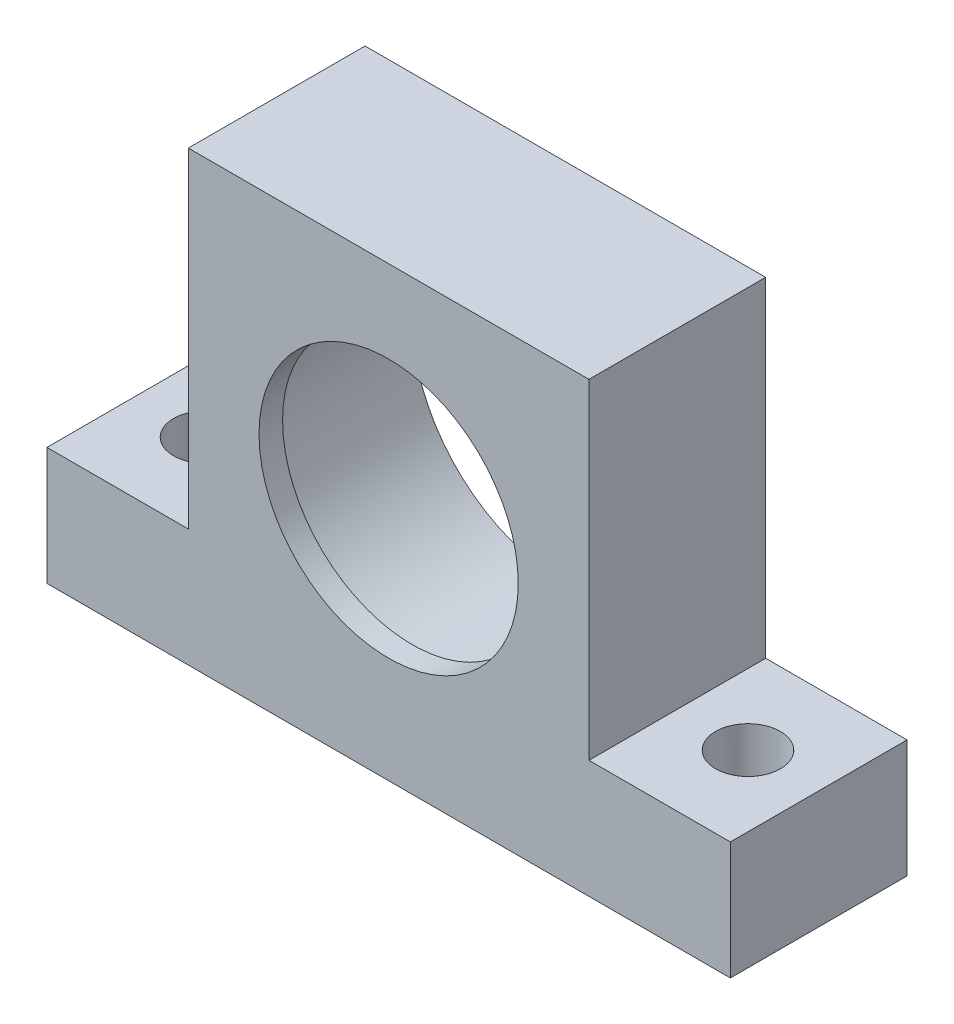
ISO-10303-21;
HEADER;
FILE_DESCRIPTION(('STEP AP214'),'2;1');
FILE_NAME('part.step','',(''),(''),'','','');
FILE_SCHEMA(('AUTOMOTIVE_DESIGN { 1 0 10303 214 1 1 1 1 }'));
ENDSEC;
DATA;
#1=APPLICATION_CONTEXT('core data for automotive mechanical design processes');
#2=APPLICATION_PROTOCOL_DEFINITION('international standard','automotive_design',2000,#1);
#3=PRODUCT_CONTEXT('',#1,'mechanical');
#4=PRODUCT('Part','Part','',(#3));
#5=PRODUCT_RELATED_PRODUCT_CATEGORY('part','',(#4));
#6=PRODUCT_DEFINITION_FORMATION('','',#4);
#7=PRODUCT_DEFINITION_CONTEXT('part definition',#1,'design');
#8=PRODUCT_DEFINITION('design','',#6,#7);
#9=PRODUCT_DEFINITION_SHAPE('','',#8);
#10=(LENGTH_UNIT() NAMED_UNIT(*) SI_UNIT(.MILLI.,.METRE.));
#11=(NAMED_UNIT(*) PLANE_ANGLE_UNIT() SI_UNIT($,.RADIAN.));
#12=(NAMED_UNIT(*) SI_UNIT($,.STERADIAN.) SOLID_ANGLE_UNIT());
#13=UNCERTAINTY_MEASURE_WITH_UNIT(LENGTH_MEASURE(1.E-05),#10,'distance_accuracy_value','');
#14=(GEOMETRIC_REPRESENTATION_CONTEXT(3) GLOBAL_UNCERTAINTY_ASSIGNED_CONTEXT((#13)) GLOBAL_UNIT_ASSIGNED_CONTEXT((#10,
#11,#12)) REPRESENTATION_CONTEXT('',''));
#15=CARTESIAN_POINT('',(0.,0.,0.));
#16=DIRECTION('',(0.,0.,1.));
#17=DIRECTION('',(1.,0.,0.));
#18=AXIS2_PLACEMENT_3D('',#15,#16,#17);
#19=CARTESIAN_POINT('',(0.,20.,15.));
#20=DIRECTION('',(0.,0.,-1.));
#21=DIRECTION('',(-1.,0.,0.));
#22=AXIS2_PLACEMENT_3D('',#19,#20,#21);
#23=CYLINDRICAL_SURFACE('',#22,11.);
#24=CARTESIAN_POINT('',(0.,20.,15.));
#25=DIRECTION('',(0.,0.,-1.));
#26=DIRECTION('',(-1.,0.,0.));
#27=AXIS2_PLACEMENT_3D('',#24,#25,#26);
#28=CIRCLE('',#27,11.);
#29=CARTESIAN_POINT('',(-11.,20.,15.));
#30=VERTEX_POINT('',#29);
#31=EDGE_CURVE('E145',#30,#30,#28,.T.);
#32=ORIENTED_EDGE('',*,*,#31,.F.);
#33=EDGE_LOOP('',(#32));
#34=FACE_BOUND('',#33,.T.);
#35=CARTESIAN_POINT('',(0.,20.,13.));
#36=DIRECTION('',(0.,0.,-1.));
#37=DIRECTION('',(-1.,0.,0.));
#38=AXIS2_PLACEMENT_3D('',#35,#36,#37);
#39=CIRCLE('',#38,11.);
#40=CARTESIAN_POINT('',(-11.,20.,13.));
#41=VERTEX_POINT('',#40);
#42=EDGE_CURVE('E170',#41,#41,#39,.F.);
#43=ORIENTED_EDGE('',*,*,#42,.F.);
#44=EDGE_LOOP('',(#43));
#45=FACE_BOUND('',#44,.T.);
#46=ADVANCED_FACE('F41',(#34,#45),#23,.F.);
#47=CARTESIAN_POINT('',(-29.,0.,15.));
#48=DIRECTION('',(1.,0.,0.));
#49=DIRECTION('',(0.,0.,-1.));
#50=AXIS2_PLACEMENT_3D('',#47,#48,#49);
#51=PLANE('',#50);
#52=DIRECTION('',(0.,-1.,0.));
#53=VECTOR('',#52,1.);
#54=CARTESIAN_POINT('',(-29.,0.,0.));
#55=LINE('',#54,#53);
#56=CARTESIAN_POINT('',(-29.,9.99999999999999,0.));
#57=VERTEX_POINT('',#56);
#58=CARTESIAN_POINT('',(-29.,0.,0.));
#59=VERTEX_POINT('',#58);
#60=EDGE_CURVE('E139',#57,#59,#55,.T.);
#61=ORIENTED_EDGE('',*,*,#60,.T.);
#62=DIRECTION('',(0.,0.,-1.));
#63=VECTOR('',#62,1.);
#64=CARTESIAN_POINT('',(-29.,0.,15.));
#65=LINE('',#64,#63);
#66=CARTESIAN_POINT('',(-29.,0.,15.));
#67=VERTEX_POINT('',#66);
#68=EDGE_CURVE('E12',#67,#59,#65,.T.);
#69=ORIENTED_EDGE('',*,*,#68,.F.);
#70=DIRECTION('',(0.,-1.,0.));
#71=VECTOR('',#70,1.);
#72=CARTESIAN_POINT('',(-29.,0.,15.));
#73=LINE('',#72,#71);
#74=CARTESIAN_POINT('',(-29.,9.99999999999999,15.));
#75=VERTEX_POINT('',#74);
#76=EDGE_CURVE('E154',#75,#67,#73,.T.);
#77=ORIENTED_EDGE('',*,*,#76,.F.);
#78=DIRECTION('',(0.,0.,-1.));
#79=VECTOR('',#78,1.);
#80=CARTESIAN_POINT('',(-29.,9.99999999999999,15.));
#81=LINE('',#80,#79);
#82=EDGE_CURVE('E138',#75,#57,#81,.T.);
#83=ORIENTED_EDGE('',*,*,#82,.T.);
#84=EDGE_LOOP('',(#61,#69,#77,#83));
#85=FACE_BOUND('',#84,.T.);
#86=ADVANCED_FACE('F43',(#85),#51,.F.);
#87=CARTESIAN_POINT('',(29.,0.,15.));
#88=DIRECTION('',(0.,1.,0.));
#89=DIRECTION('',(0.,0.,1.));
#90=AXIS2_PLACEMENT_3D('',#87,#88,#89);
#91=PLANE('',#90);
#92=CARTESIAN_POINT('',(-23.,0.,7.5));
#93=DIRECTION('',(0.,-1.,0.));
#94=DIRECTION('',(0.,0.,-1.));
#95=AXIS2_PLACEMENT_3D('',#92,#93,#94);
#96=CIRCLE('',#95,2.75);
#97=CARTESIAN_POINT('',(-23.,0.,4.75));
#98=VERTEX_POINT('',#97);
#99=EDGE_CURVE('E175',#98,#98,#96,.T.);
#100=ORIENTED_EDGE('',*,*,#99,.F.);
#101=EDGE_LOOP('',(#100));
#102=FACE_BOUND('',#101,.T.);
#103=CARTESIAN_POINT('',(23.,0.,7.5));
#104=DIRECTION('',(0.,-1.,0.));
#105=DIRECTION('',(0.,0.,1.));
#106=AXIS2_PLACEMENT_3D('',#103,#104,#105);
#107=CIRCLE('',#106,2.75);
#108=CARTESIAN_POINT('',(23.,0.,10.25));
#109=VERTEX_POINT('',#108);
#110=EDGE_CURVE('E176',#109,#109,#107,.T.);
#111=ORIENTED_EDGE('',*,*,#110,.F.);
#112=EDGE_LOOP('',(#111));
#113=FACE_BOUND('',#112,.T.);
#114=DIRECTION('',(1.,0.,0.));
#115=VECTOR('',#114,1.);
#116=CARTESIAN_POINT('',(29.,0.,0.));
#117=LINE('',#116,#115);
#118=CARTESIAN_POINT('',(29.,0.,0.));
#119=VERTEX_POINT('',#118);
#120=EDGE_CURVE('E141',#59,#119,#117,.T.);
#121=ORIENTED_EDGE('',*,*,#120,.T.);
#122=DIRECTION('',(0.,0.,-1.));
#123=VECTOR('',#122,1.);
#124=CARTESIAN_POINT('',(29.,0.,15.));
#125=LINE('',#124,#123);
#126=CARTESIAN_POINT('',(29.,0.,15.));
#127=VERTEX_POINT('',#126);
#128=EDGE_CURVE('E51',#127,#119,#125,.T.);
#129=ORIENTED_EDGE('',*,*,#128,.F.);
#130=DIRECTION('',(1.,0.,0.));
#131=VECTOR('',#130,1.);
#132=CARTESIAN_POINT('',(29.,0.,15.));
#133=LINE('',#132,#131);
#134=EDGE_CURVE('E103',#67,#127,#133,.T.);
#135=ORIENTED_EDGE('',*,*,#134,.F.);
#136=ORIENTED_EDGE('',*,*,#68,.T.);
#137=EDGE_LOOP('',(#121,#129,#135,#136));
#138=FACE_BOUND('',#137,.T.);
#139=ADVANCED_FACE('F231',(#102,#113,#138),#91,.F.);
#140=CARTESIAN_POINT('',(29.,0.,15.));
#141=DIRECTION('',(-1.,0.,0.));
#142=DIRECTION('',(0.,-1.,0.));
#143=AXIS2_PLACEMENT_3D('',#140,#141,#142);
#144=PLANE('',#143);
#145=DIRECTION('',(0.,1.,0.));
#146=VECTOR('',#145,1.);
#147=CARTESIAN_POINT('',(29.,0.,0.));
#148=LINE('',#147,#146);
#149=CARTESIAN_POINT('',(29.,10.,0.));
#150=VERTEX_POINT('',#149);
#151=EDGE_CURVE('E148',#119,#150,#148,.T.);
#152=ORIENTED_EDGE('',*,*,#151,.T.);
#153=DIRECTION('',(0.,0.,-1.));
#154=VECTOR('',#153,1.);
#155=CARTESIAN_POINT('',(29.,10.,15.));
#156=LINE('',#155,#154);
#157=CARTESIAN_POINT('',(29.,10.,15.));
#158=VERTEX_POINT('',#157);
#159=EDGE_CURVE('E165',#158,#150,#156,.T.);
#160=ORIENTED_EDGE('',*,*,#159,.F.);
#161=DIRECTION('',(0.,1.,0.));
#162=VECTOR('',#161,1.);
#163=CARTESIAN_POINT('',(29.,0.,15.));
#164=LINE('',#163,#162);
#165=EDGE_CURVE('E191',#127,#158,#164,.T.);
#166=ORIENTED_EDGE('',*,*,#165,.F.);
#167=ORIENTED_EDGE('',*,*,#128,.T.);
#168=EDGE_LOOP('',(#152,#160,#166,#167));
#169=FACE_BOUND('',#168,.T.);
#170=ADVANCED_FACE('F269',(#169),#144,.F.);
#171=CARTESIAN_POINT('',(29.,10.,15.));
#172=DIRECTION('',(0.,-1.,0.));
#173=DIRECTION('',(1.,0.,0.));
#174=AXIS2_PLACEMENT_3D('',#171,#172,#173);
#175=PLANE('',#174);
#176=CARTESIAN_POINT('',(23.,10.,7.5));
#177=DIRECTION('',(0.,-1.,0.));
#178=DIRECTION('',(1.,0.,0.));
#179=AXIS2_PLACEMENT_3D('',#176,#177,#178);
#180=CIRCLE('',#179,2.75);
#181=CARTESIAN_POINT('',(25.75,10.,7.5));
#182=VERTEX_POINT('',#181);
#183=EDGE_CURVE('E44',#182,#182,#180,.T.);
#184=ORIENTED_EDGE('',*,*,#183,.T.);
#185=EDGE_LOOP('',(#184));
#186=FACE_BOUND('',#185,.T.);
#187=DIRECTION('',(-1.,0.,0.));
#188=VECTOR('',#187,1.);
#189=CARTESIAN_POINT('',(29.,10.,0.));
#190=LINE('',#189,#188);
#191=CARTESIAN_POINT('',(17.,10.,0.));
#192=VERTEX_POINT('',#191);
#193=EDGE_CURVE('E146',#150,#192,#190,.T.);
#194=ORIENTED_EDGE('',*,*,#193,.T.);
#195=DIRECTION('',(0.,0.,-1.));
#196=VECTOR('',#195,1.);
#197=CARTESIAN_POINT('',(17.,10.,15.));
#198=LINE('',#197,#196);
#199=CARTESIAN_POINT('',(17.,10.,15.));
#200=VERTEX_POINT('',#199);
#201=EDGE_CURVE('E157',#200,#192,#198,.T.);
#202=ORIENTED_EDGE('',*,*,#201,.F.);
#203=DIRECTION('',(-1.,0.,0.));
#204=VECTOR('',#203,1.);
#205=CARTESIAN_POINT('',(29.,10.,15.));
#206=LINE('',#205,#204);
#207=EDGE_CURVE('E194',#158,#200,#206,.T.);
#208=ORIENTED_EDGE('',*,*,#207,.F.);
#209=ORIENTED_EDGE('',*,*,#159,.T.);
#210=EDGE_LOOP('',(#194,#202,#208,#209));
#211=FACE_BOUND('',#210,.T.);
#212=ADVANCED_FACE('F203',(#186,#211),#175,.F.);
#213=CARTESIAN_POINT('',(17.,10.,15.));
#214=DIRECTION('',(-1.,0.,0.));
#215=DIRECTION('',(0.,-1.,0.));
#216=AXIS2_PLACEMENT_3D('',#213,#214,#215);
#217=PLANE('',#216);
#218=DIRECTION('',(0.,1.,0.));
#219=VECTOR('',#218,1.);
#220=CARTESIAN_POINT('',(17.,10.,0.));
#221=LINE('',#220,#219);
#222=CARTESIAN_POINT('',(17.,38.,0.));
#223=VERTEX_POINT('',#222);
#224=EDGE_CURVE('E147',#192,#223,#221,.T.);
#225=ORIENTED_EDGE('',*,*,#224,.T.);
#226=DIRECTION('',(0.,0.,-1.));
#227=VECTOR('',#226,1.);
#228=CARTESIAN_POINT('',(17.,38.,15.));
#229=LINE('',#228,#227);
#230=CARTESIAN_POINT('',(17.,38.,15.));
#231=VERTEX_POINT('',#230);
#232=EDGE_CURVE('E133',#231,#223,#229,.T.);
#233=ORIENTED_EDGE('',*,*,#232,.F.);
#234=DIRECTION('',(0.,1.,0.));
#235=VECTOR('',#234,1.);
#236=CARTESIAN_POINT('',(17.,10.,15.));
#237=LINE('',#236,#235);
#238=EDGE_CURVE('E125',#200,#231,#237,.T.);
#239=ORIENTED_EDGE('',*,*,#238,.F.);
#240=ORIENTED_EDGE('',*,*,#201,.T.);
#241=EDGE_LOOP('',(#225,#233,#239,#240));
#242=FACE_BOUND('',#241,.T.);
#243=ADVANCED_FACE('F202',(#242),#217,.F.);
#244=CARTESIAN_POINT('',(-17.,38.,15.));
#245=DIRECTION('',(0.,-1.,0.));
#246=DIRECTION('',(1.,0.,0.));
#247=AXIS2_PLACEMENT_3D('',#244,#245,#246);
#248=PLANE('',#247);
#249=DIRECTION('',(-1.,0.,0.));
#250=VECTOR('',#249,1.);
#251=CARTESIAN_POINT('',(-17.,38.,0.));
#252=LINE('',#251,#250);
#253=CARTESIAN_POINT('',(-17.,38.,0.));
#254=VERTEX_POINT('',#253);
#255=EDGE_CURVE('E128',#223,#254,#252,.T.);
#256=ORIENTED_EDGE('',*,*,#255,.T.);
#257=DIRECTION('',(0.,0.,-1.));
#258=VECTOR('',#257,1.);
#259=CARTESIAN_POINT('',(-17.,38.,15.));
#260=LINE('',#259,#258);
#261=CARTESIAN_POINT('',(-17.,38.,15.));
#262=VERTEX_POINT('',#261);
#263=EDGE_CURVE('E130',#262,#254,#260,.T.);
#264=ORIENTED_EDGE('',*,*,#263,.F.);
#265=DIRECTION('',(-1.,0.,0.));
#266=VECTOR('',#265,1.);
#267=CARTESIAN_POINT('',(-17.,38.,15.));
#268=LINE('',#267,#266);
#269=EDGE_CURVE('E118',#231,#262,#268,.T.);
#270=ORIENTED_EDGE('',*,*,#269,.F.);
#271=ORIENTED_EDGE('',*,*,#232,.T.);
#272=EDGE_LOOP('',(#256,#264,#270,#271));
#273=FACE_BOUND('',#272,.T.);
#274=ADVANCED_FACE('F126',(#273),#248,.F.);
#275=CARTESIAN_POINT('',(-17.,9.99999999999999,15.));
#276=DIRECTION('',(1.,0.,0.));
#277=DIRECTION('',(0.,1.,0.));
#278=AXIS2_PLACEMENT_3D('',#275,#276,#277);
#279=PLANE('',#278);
#280=DIRECTION('',(0.,-1.,0.));
#281=VECTOR('',#280,1.);
#282=CARTESIAN_POINT('',(-17.,9.99999999999999,0.));
#283=LINE('',#282,#281);
#284=CARTESIAN_POINT('',(-17.,9.99999999999999,0.));
#285=VERTEX_POINT('',#284);
#286=EDGE_CURVE('E90',#254,#285,#283,.T.);
#287=ORIENTED_EDGE('',*,*,#286,.T.);
#288=DIRECTION('',(0.,0.,-1.));
#289=VECTOR('',#288,1.);
#290=CARTESIAN_POINT('',(-17.,9.99999999999999,15.));
#291=LINE('',#290,#289);
#292=CARTESIAN_POINT('',(-17.,9.99999999999999,15.));
#293=VERTEX_POINT('',#292);
#294=EDGE_CURVE('E135',#293,#285,#291,.T.);
#295=ORIENTED_EDGE('',*,*,#294,.F.);
#296=DIRECTION('',(0.,-1.,0.));
#297=VECTOR('',#296,1.);
#298=CARTESIAN_POINT('',(-17.,9.99999999999999,15.));
#299=LINE('',#298,#297);
#300=EDGE_CURVE('E117',#262,#293,#299,.T.);
#301=ORIENTED_EDGE('',*,*,#300,.F.);
#302=ORIENTED_EDGE('',*,*,#263,.T.);
#303=EDGE_LOOP('',(#287,#295,#301,#302));
#304=FACE_BOUND('',#303,.T.);
#305=ADVANCED_FACE('F134',(#304),#279,.F.);
#306=CARTESIAN_POINT('',(-29.,9.99999999999999,15.));
#307=DIRECTION('',(0.,-1.,0.));
#308=DIRECTION('',(0.,0.,-1.));
#309=AXIS2_PLACEMENT_3D('',#306,#307,#308);
#310=PLANE('',#309);
#311=CARTESIAN_POINT('',(-23.,9.99999999999999,7.5));
#312=DIRECTION('',(0.,-1.,0.));
#313=DIRECTION('',(0.,0.,-1.));
#314=AXIS2_PLACEMENT_3D('',#311,#312,#313);
#315=CIRCLE('',#314,2.75);
#316=CARTESIAN_POINT('',(-23.,9.99999999999999,4.75));
#317=VERTEX_POINT('',#316);
#318=EDGE_CURVE('E168',#317,#317,#315,.T.);
#319=ORIENTED_EDGE('',*,*,#318,.T.);
#320=EDGE_LOOP('',(#319));
#321=FACE_BOUND('',#320,.T.);
#322=DIRECTION('',(-1.,0.,0.));
#323=VECTOR('',#322,1.);
#324=CARTESIAN_POINT('',(-29.,9.99999999999999,0.));
#325=LINE('',#324,#323);
#326=EDGE_CURVE('E92',#285,#57,#325,.T.);
#327=ORIENTED_EDGE('',*,*,#326,.T.);
#328=ORIENTED_EDGE('',*,*,#82,.F.);
#329=DIRECTION('',(-1.,0.,0.));
#330=VECTOR('',#329,1.);
#331=CARTESIAN_POINT('',(-29.,9.99999999999999,15.));
#332=LINE('',#331,#330);
#333=EDGE_CURVE('E58',#293,#75,#332,.T.);
#334=ORIENTED_EDGE('',*,*,#333,.F.);
#335=ORIENTED_EDGE('',*,*,#294,.T.);
#336=EDGE_LOOP('',(#327,#328,#334,#335));
#337=FACE_BOUND('',#336,.T.);
#338=ADVANCED_FACE('F213',(#321,#337),#310,.F.);
#339=CARTESIAN_POINT('',(0.,0.,15.));
#340=DIRECTION('',(0.,0.,-1.));
#341=DIRECTION('',(-1.,0.,0.));
#342=AXIS2_PLACEMENT_3D('',#339,#340,#341);
#343=PLANE('',#342);
#344=ORIENTED_EDGE('',*,*,#31,.T.);
#345=EDGE_LOOP('',(#344));
#346=FACE_BOUND('',#345,.T.);
#347=ORIENTED_EDGE('',*,*,#76,.T.);
#348=ORIENTED_EDGE('',*,*,#134,.T.);
#349=ORIENTED_EDGE('',*,*,#165,.T.);
#350=ORIENTED_EDGE('',*,*,#207,.T.);
#351=ORIENTED_EDGE('',*,*,#238,.T.);
#352=ORIENTED_EDGE('',*,*,#269,.T.);
#353=ORIENTED_EDGE('',*,*,#300,.T.);
#354=ORIENTED_EDGE('',*,*,#333,.T.);
#355=EDGE_LOOP('',(#347,#348,#349,#350,#351,#352,#353,#354));
#356=FACE_BOUND('',#355,.T.);
#357=ADVANCED_FACE('F116',(#346,#356),#343,.F.);
#358=CARTESIAN_POINT('',(0.,0.,0.));
#359=DIRECTION('',(0.,0.,-1.));
#360=DIRECTION('',(-1.,0.,0.));
#361=AXIS2_PLACEMENT_3D('',#358,#359,#360);
#362=PLANE('',#361);
#363=CARTESIAN_POINT('',(0.,20.,0.));
#364=DIRECTION('',(0.,0.,-1.));
#365=DIRECTION('',(-1.,0.,0.));
#366=AXIS2_PLACEMENT_3D('',#363,#364,#365);
#367=CIRCLE('',#366,13.);
#368=CARTESIAN_POINT('',(-13.,20.,0.));
#369=VERTEX_POINT('',#368);
#370=EDGE_CURVE('E178',#369,#369,#367,.T.);
#371=ORIENTED_EDGE('',*,*,#370,.F.);
#372=EDGE_LOOP('',(#371));
#373=FACE_BOUND('',#372,.T.);
#374=ORIENTED_EDGE('',*,*,#60,.F.);
#375=ORIENTED_EDGE('',*,*,#326,.F.);
#376=ORIENTED_EDGE('',*,*,#286,.F.);
#377=ORIENTED_EDGE('',*,*,#255,.F.);
#378=ORIENTED_EDGE('',*,*,#224,.F.);
#379=ORIENTED_EDGE('',*,*,#193,.F.);
#380=ORIENTED_EDGE('',*,*,#151,.F.);
#381=ORIENTED_EDGE('',*,*,#120,.F.);
#382=EDGE_LOOP('',(#374,#375,#376,#377,#378,#379,#380,#381));
#383=FACE_BOUND('',#382,.T.);
#384=ADVANCED_FACE('F208',(#373,#383),#362,.T.);
#385=CARTESIAN_POINT('',(0.,0.,13.));
#386=DIRECTION('',(0.,0.,-1.));
#387=DIRECTION('',(-1.,0.,0.));
#388=AXIS2_PLACEMENT_3D('',#385,#386,#387);
#389=PLANE('',#388);
#390=CARTESIAN_POINT('',(0.,20.,13.));
#391=DIRECTION('',(0.,0.,-1.));
#392=DIRECTION('',(-1.,0.,0.));
#393=AXIS2_PLACEMENT_3D('',#390,#391,#392);
#394=CIRCLE('',#393,13.);
#395=CARTESIAN_POINT('',(-13.,20.,13.));
#396=VERTEX_POINT('',#395);
#397=EDGE_CURVE('E166',#396,#396,#394,.F.);
#398=ORIENTED_EDGE('',*,*,#397,.F.);
#399=EDGE_LOOP('',(#398));
#400=FACE_BOUND('',#399,.T.);
#401=ORIENTED_EDGE('',*,*,#42,.T.);
#402=EDGE_LOOP('',(#401));
#403=FACE_BOUND('',#402,.T.);
#404=ADVANCED_FACE('F239',(#400,#403),#389,.T.);
#405=CARTESIAN_POINT('',(0.,20.,51.7695526217005));
#406=DIRECTION('',(0.,0.,-1.));
#407=DIRECTION('',(-1.,0.,0.));
#408=AXIS2_PLACEMENT_3D('',#405,#406,#407);
#409=CYLINDRICAL_SURFACE('',#408,13.);
#410=ORIENTED_EDGE('',*,*,#397,.T.);
#411=EDGE_LOOP('',(#410));
#412=FACE_BOUND('',#411,.T.);
#413=ORIENTED_EDGE('',*,*,#370,.T.);
#414=EDGE_LOOP('',(#413));
#415=FACE_BOUND('',#414,.T.);
#416=ADVANCED_FACE('F240',(#412,#415),#409,.F.);
#417=CARTESIAN_POINT('',(-23.,38.,7.5));
#418=DIRECTION('',(0.,-1.,0.));
#419=DIRECTION('',(0.,0.,-1.));
#420=AXIS2_PLACEMENT_3D('',#417,#418,#419);
#421=CYLINDRICAL_SURFACE('',#420,2.75);
#422=ORIENTED_EDGE('',*,*,#99,.T.);
#423=EDGE_LOOP('',(#422));
#424=FACE_BOUND('',#423,.T.);
#425=ORIENTED_EDGE('',*,*,#318,.F.);
#426=EDGE_LOOP('',(#425));
#427=FACE_BOUND('',#426,.T.);
#428=ADVANCED_FACE('F246',(#424,#427),#421,.F.);
#429=CARTESIAN_POINT('',(23.,38.,7.5));
#430=DIRECTION('',(0.,-1.,0.));
#431=DIRECTION('',(0.,0.,-1.));
#432=AXIS2_PLACEMENT_3D('',#429,#430,#431);
#433=CYLINDRICAL_SURFACE('',#432,2.75);
#434=ORIENTED_EDGE('',*,*,#110,.T.);
#435=EDGE_LOOP('',(#434));
#436=FACE_BOUND('',#435,.T.);
#437=ORIENTED_EDGE('',*,*,#183,.F.);
#438=EDGE_LOOP('',(#437));
#439=FACE_BOUND('',#438,.T.);
#440=ADVANCED_FACE('F251',(#436,#439),#433,.F.);
#441=CLOSED_SHELL('',(#46,#86,#139,#170,#212,#243,#274,#305,#338,#357,#384,#404,#416,#428,#440));
#442=MANIFOLD_SOLID_BREP('B2',#441);
#443=ADVANCED_BREP_SHAPE_REPRESENTATION('',(#18,#442),#14);
#444=SHAPE_DEFINITION_REPRESENTATION(#9,#443);
ENDSEC;
END-ISO-10303-21;
